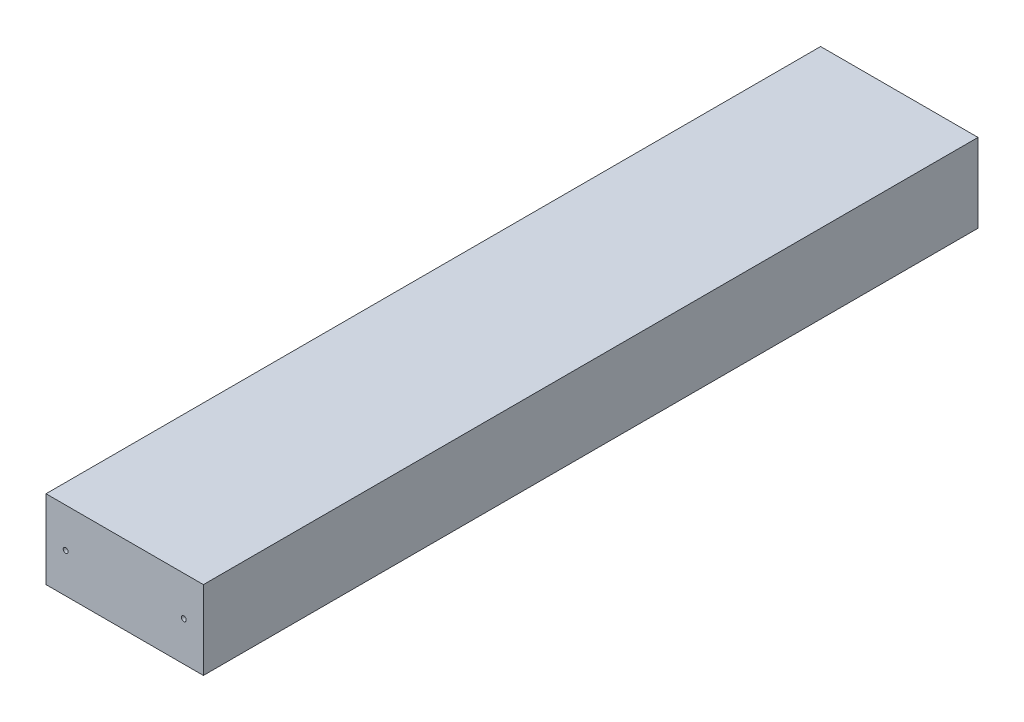
ISO-10303-21;
HEADER;
FILE_DESCRIPTION(('STEP AP214'),'2;1');
FILE_NAME('part.step','',(''),(''),'','','');
FILE_SCHEMA(('AUTOMOTIVE_DESIGN { 1 0 10303 214 1 1 1 1 }'));
ENDSEC;
DATA;
#1=APPLICATION_CONTEXT('core data for automotive mechanical design processes');
#2=APPLICATION_PROTOCOL_DEFINITION('international standard','automotive_design',2000,#1);
#3=PRODUCT_CONTEXT('',#1,'mechanical');
#4=PRODUCT('Part','Part','',(#3));
#5=PRODUCT_RELATED_PRODUCT_CATEGORY('part','',(#4));
#6=PRODUCT_DEFINITION_FORMATION('','',#4);
#7=PRODUCT_DEFINITION_CONTEXT('part definition',#1,'design');
#8=PRODUCT_DEFINITION('design','',#6,#7);
#9=PRODUCT_DEFINITION_SHAPE('','',#8);
#10=(LENGTH_UNIT() NAMED_UNIT(*) SI_UNIT(.MILLI.,.METRE.));
#11=(NAMED_UNIT(*) PLANE_ANGLE_UNIT() SI_UNIT($,.RADIAN.));
#12=(NAMED_UNIT(*) SI_UNIT($,.STERADIAN.) SOLID_ANGLE_UNIT());
#13=UNCERTAINTY_MEASURE_WITH_UNIT(LENGTH_MEASURE(1.E-05),#10,'distance_accuracy_value','');
#14=(GEOMETRIC_REPRESENTATION_CONTEXT(3) GLOBAL_UNCERTAINTY_ASSIGNED_CONTEXT((#13)) GLOBAL_UNIT_ASSIGNED_CONTEXT((#10,
#11,#12)) REPRESENTATION_CONTEXT('',''));
#15=CARTESIAN_POINT('',(0.,0.,0.));
#16=DIRECTION('',(0.,0.,1.));
#17=DIRECTION('',(1.,0.,0.));
#18=AXIS2_PLACEMENT_3D('',#15,#16,#17);
#19=CARTESIAN_POINT('',(50.8,-25.4,500.));
#20=DIRECTION('',(-1.,0.,0.));
#21=DIRECTION('',(0.,0.,1.));
#22=AXIS2_PLACEMENT_3D('',#19,#20,#21);
#23=PLANE('',#22);
#24=DIRECTION('',(0.,1.,0.));
#25=VECTOR('',#24,1.);
#26=CARTESIAN_POINT('',(50.8,-25.4,0.));
#27=LINE('',#26,#25);
#28=CARTESIAN_POINT('',(50.8,-25.4,0.));
#29=VERTEX_POINT('',#28);
#30=CARTESIAN_POINT('',(50.8,25.4,0.));
#31=VERTEX_POINT('',#30);
#32=EDGE_CURVE('E119',#29,#31,#27,.T.);
#33=ORIENTED_EDGE('',*,*,#32,.T.);
#34=DIRECTION('',(0.,0.,-1.));
#35=VECTOR('',#34,1.);
#36=CARTESIAN_POINT('',(50.8,25.4,500.));
#37=LINE('',#36,#35);
#38=CARTESIAN_POINT('',(50.8,25.4,500.));
#39=VERTEX_POINT('',#38);
#40=EDGE_CURVE('E11',#39,#31,#37,.T.);
#41=ORIENTED_EDGE('',*,*,#40,.F.);
#42=DIRECTION('',(0.,1.,0.));
#43=VECTOR('',#42,1.);
#44=CARTESIAN_POINT('',(50.8,-25.4,500.));
#45=LINE('',#44,#43);
#46=CARTESIAN_POINT('',(50.8,-25.4,500.));
#47=VERTEX_POINT('',#46);
#48=EDGE_CURVE('E102',#47,#39,#45,.T.);
#49=ORIENTED_EDGE('',*,*,#48,.F.);
#50=DIRECTION('',(0.,0.,-1.));
#51=VECTOR('',#50,1.);
#52=CARTESIAN_POINT('',(50.8,-25.4,500.));
#53=LINE('',#52,#51);
#54=EDGE_CURVE('E115',#47,#29,#53,.T.);
#55=ORIENTED_EDGE('',*,*,#54,.T.);
#56=EDGE_LOOP('',(#33,#41,#49,#55));
#57=FACE_BOUND('',#56,.T.);
#58=ADVANCED_FACE('F42',(#57),#23,.F.);
#59=CARTESIAN_POINT('',(-50.8,25.4,500.));
#60=DIRECTION('',(0.,-1.,0.));
#61=DIRECTION('',(0.,0.,-1.));
#62=AXIS2_PLACEMENT_3D('',#59,#60,#61);
#63=PLANE('',#62);
#64=DIRECTION('',(-1.,0.,0.));
#65=VECTOR('',#64,1.);
#66=CARTESIAN_POINT('',(-50.8,25.4,0.));
#67=LINE('',#66,#65);
#68=CARTESIAN_POINT('',(-50.8,25.4,0.));
#69=VERTEX_POINT('',#68);
#70=EDGE_CURVE('E107',#31,#69,#67,.T.);
#71=ORIENTED_EDGE('',*,*,#70,.T.);
#72=DIRECTION('',(0.,0.,-1.));
#73=VECTOR('',#72,1.);
#74=CARTESIAN_POINT('',(-50.8,25.4,500.));
#75=LINE('',#74,#73);
#76=CARTESIAN_POINT('',(-50.8,25.4,500.));
#77=VERTEX_POINT('',#76);
#78=EDGE_CURVE('E51',#77,#69,#75,.T.);
#79=ORIENTED_EDGE('',*,*,#78,.F.);
#80=DIRECTION('',(-1.,0.,0.));
#81=VECTOR('',#80,1.);
#82=CARTESIAN_POINT('',(-50.8,25.4,500.));
#83=LINE('',#82,#81);
#84=EDGE_CURVE('E97',#39,#77,#83,.T.);
#85=ORIENTED_EDGE('',*,*,#84,.F.);
#86=ORIENTED_EDGE('',*,*,#40,.T.);
#87=EDGE_LOOP('',(#71,#79,#85,#86));
#88=FACE_BOUND('',#87,.T.);
#89=ADVANCED_FACE('F106',(#88),#63,.F.);
#90=CARTESIAN_POINT('',(-50.8,-25.4,500.));
#91=DIRECTION('',(1.,0.,0.));
#92=DIRECTION('',(0.,0.,-1.));
#93=AXIS2_PLACEMENT_3D('',#90,#91,#92);
#94=PLANE('',#93);
#95=DIRECTION('',(0.,-1.,0.));
#96=VECTOR('',#95,1.);
#97=CARTESIAN_POINT('',(-50.8,-25.4,0.));
#98=LINE('',#97,#96);
#99=CARTESIAN_POINT('',(-50.8,-25.4,0.));
#100=VERTEX_POINT('',#99);
#101=EDGE_CURVE('E84',#69,#100,#98,.T.);
#102=ORIENTED_EDGE('',*,*,#101,.T.);
#103=DIRECTION('',(0.,0.,-1.));
#104=VECTOR('',#103,1.);
#105=CARTESIAN_POINT('',(-50.8,-25.4,500.));
#106=LINE('',#105,#104);
#107=CARTESIAN_POINT('',(-50.8,-25.4,500.));
#108=VERTEX_POINT('',#107);
#109=EDGE_CURVE('E109',#108,#100,#106,.T.);
#110=ORIENTED_EDGE('',*,*,#109,.F.);
#111=DIRECTION('',(0.,-1.,0.));
#112=VECTOR('',#111,1.);
#113=CARTESIAN_POINT('',(-50.8,-25.4,500.));
#114=LINE('',#113,#112);
#115=EDGE_CURVE('E100',#77,#108,#114,.T.);
#116=ORIENTED_EDGE('',*,*,#115,.F.);
#117=ORIENTED_EDGE('',*,*,#78,.T.);
#118=EDGE_LOOP('',(#102,#110,#116,#117));
#119=FACE_BOUND('',#118,.T.);
#120=ADVANCED_FACE('F110',(#119),#94,.F.);
#121=CARTESIAN_POINT('',(-50.8,-25.4,500.));
#122=DIRECTION('',(0.,1.,0.));
#123=DIRECTION('',(0.,0.,1.));
#124=AXIS2_PLACEMENT_3D('',#121,#122,#123);
#125=PLANE('',#124);
#126=DIRECTION('',(1.,0.,0.));
#127=VECTOR('',#126,1.);
#128=CARTESIAN_POINT('',(-50.8,-25.4,0.));
#129=LINE('',#128,#127);
#130=EDGE_CURVE('E90',#100,#29,#129,.T.);
#131=ORIENTED_EDGE('',*,*,#130,.T.);
#132=ORIENTED_EDGE('',*,*,#54,.F.);
#133=DIRECTION('',(1.,0.,0.));
#134=VECTOR('',#133,1.);
#135=CARTESIAN_POINT('',(-50.8,-25.4,500.));
#136=LINE('',#135,#134);
#137=EDGE_CURVE('E62',#108,#47,#136,.T.);
#138=ORIENTED_EDGE('',*,*,#137,.F.);
#139=ORIENTED_EDGE('',*,*,#109,.T.);
#140=EDGE_LOOP('',(#131,#132,#138,#139));
#141=FACE_BOUND('',#140,.T.);
#142=ADVANCED_FACE('F134',(#141),#125,.F.);
#143=CARTESIAN_POINT('',(0.,0.,500.));
#144=DIRECTION('',(0.,0.,-1.));
#145=DIRECTION('',(-1.,0.,0.));
#146=AXIS2_PLACEMENT_3D('',#143,#144,#145);
#147=PLANE('',#146);
#148=CARTESIAN_POINT('',(-38.1,0.,500.));
#149=DIRECTION('',(0.,0.,1.));
#150=DIRECTION('',(1.,0.,0.));
#151=AXIS2_PLACEMENT_3D('',#148,#149,#150);
#152=CIRCLE('',#151,1.58750000000001);
#153=CARTESIAN_POINT('',(-36.5125,0.,500.));
#154=VERTEX_POINT('',#153);
#155=EDGE_CURVE('E150',#154,#154,#152,.T.);
#156=ORIENTED_EDGE('',*,*,#155,.F.);
#157=EDGE_LOOP('',(#156));
#158=FACE_BOUND('',#157,.T.);
#159=CARTESIAN_POINT('',(38.1,0.,500.));
#160=DIRECTION('',(0.,0.,1.));
#161=DIRECTION('',(1.,0.,0.));
#162=AXIS2_PLACEMENT_3D('',#159,#160,#161);
#163=CIRCLE('',#162,1.58750000000001);
#164=CARTESIAN_POINT('',(39.6875,0.,500.));
#165=VERTEX_POINT('',#164);
#166=EDGE_CURVE('E142',#165,#165,#163,.T.);
#167=ORIENTED_EDGE('',*,*,#166,.F.);
#168=EDGE_LOOP('',(#167));
#169=FACE_BOUND('',#168,.T.);
#170=ORIENTED_EDGE('',*,*,#48,.T.);
#171=ORIENTED_EDGE('',*,*,#84,.T.);
#172=ORIENTED_EDGE('',*,*,#115,.T.);
#173=ORIENTED_EDGE('',*,*,#137,.T.);
#174=EDGE_LOOP('',(#170,#171,#172,#173));
#175=FACE_BOUND('',#174,.T.);
#176=ADVANCED_FACE('F98',(#158,#169,#175),#147,.F.);
#177=CARTESIAN_POINT('',(0.,0.,0.));
#178=DIRECTION('',(0.,0.,-1.));
#179=DIRECTION('',(-1.,0.,0.));
#180=AXIS2_PLACEMENT_3D('',#177,#178,#179);
#181=PLANE('',#180);
#182=CARTESIAN_POINT('',(-38.1,0.,0.));
#183=DIRECTION('',(0.,0.,1.));
#184=DIRECTION('',(1.,0.,0.));
#185=AXIS2_PLACEMENT_3D('',#182,#183,#184);
#186=CIRCLE('',#185,1.58750000000001);
#187=CARTESIAN_POINT('',(-36.5125,0.,0.));
#188=VERTEX_POINT('',#187);
#189=EDGE_CURVE('E163',#188,#188,#186,.T.);
#190=ORIENTED_EDGE('',*,*,#189,.T.);
#191=EDGE_LOOP('',(#190));
#192=FACE_BOUND('',#191,.T.);
#193=CARTESIAN_POINT('',(38.1,0.,0.));
#194=DIRECTION('',(0.,0.,1.));
#195=DIRECTION('',(1.,0.,0.));
#196=AXIS2_PLACEMENT_3D('',#193,#194,#195);
#197=CIRCLE('',#196,1.58750000000001);
#198=CARTESIAN_POINT('',(39.6875,0.,0.));
#199=VERTEX_POINT('',#198);
#200=EDGE_CURVE('E155',#199,#199,#197,.T.);
#201=ORIENTED_EDGE('',*,*,#200,.T.);
#202=EDGE_LOOP('',(#201));
#203=FACE_BOUND('',#202,.T.);
#204=ORIENTED_EDGE('',*,*,#32,.F.);
#205=ORIENTED_EDGE('',*,*,#130,.F.);
#206=ORIENTED_EDGE('',*,*,#101,.F.);
#207=ORIENTED_EDGE('',*,*,#70,.F.);
#208=EDGE_LOOP('',(#204,#205,#206,#207));
#209=FACE_BOUND('',#208,.T.);
#210=ADVANCED_FACE('F137',(#192,#203,#209),#181,.T.);
#211=CARTESIAN_POINT('',(38.1,0.,455.55));
#212=DIRECTION('',(0.,0.,1.));
#213=DIRECTION('',(1.,0.,0.));
#214=AXIS2_PLACEMENT_3D('',#211,#212,#213);
#215=CYLINDRICAL_SURFACE('',#214,1.58750000000001);
#216=CARTESIAN_POINT('',(38.1,0.,455.55));
#217=DIRECTION('',(0.,0.,1.));
#218=DIRECTION('',(1.,0.,0.));
#219=AXIS2_PLACEMENT_3D('',#216,#217,#218);
#220=CIRCLE('',#219,1.58750000000001);
#221=CARTESIAN_POINT('',(39.6875,0.,455.55));
#222=VERTEX_POINT('',#221);
#223=EDGE_CURVE('E145',#222,#222,#220,.T.);
#224=ORIENTED_EDGE('',*,*,#223,.F.);
#225=EDGE_LOOP('',(#224));
#226=FACE_BOUND('',#225,.T.);
#227=ORIENTED_EDGE('',*,*,#166,.T.);
#228=EDGE_LOOP('',(#227));
#229=FACE_BOUND('',#228,.T.);
#230=ADVANCED_FACE('F195',(#226,#229),#215,.F.);
#231=CARTESIAN_POINT('',(38.1,0.,455.55));
#232=DIRECTION('',(0.,0.,1.));
#233=DIRECTION('',(1.,0.,0.));
#234=AXIS2_PLACEMENT_3D('',#231,#232,#233);
#235=PLANE('',#234);
#236=ORIENTED_EDGE('',*,*,#223,.T.);
#237=EDGE_LOOP('',(#236));
#238=FACE_BOUND('',#237,.T.);
#239=ADVANCED_FACE('F202',(#238),#235,.T.);
#240=CARTESIAN_POINT('',(-38.1,0.,455.55));
#241=DIRECTION('',(0.,0.,1.));
#242=DIRECTION('',(1.,0.,0.));
#243=AXIS2_PLACEMENT_3D('',#240,#241,#242);
#244=CYLINDRICAL_SURFACE('',#243,1.58750000000001);
#245=CARTESIAN_POINT('',(-38.1,0.,455.55));
#246=DIRECTION('',(0.,0.,1.));
#247=DIRECTION('',(1.,0.,0.));
#248=AXIS2_PLACEMENT_3D('',#245,#246,#247);
#249=CIRCLE('',#248,1.58750000000001);
#250=CARTESIAN_POINT('',(-36.5125,0.,455.55));
#251=VERTEX_POINT('',#250);
#252=EDGE_CURVE('E123',#251,#251,#249,.T.);
#253=ORIENTED_EDGE('',*,*,#252,.F.);
#254=EDGE_LOOP('',(#253));
#255=FACE_BOUND('',#254,.T.);
#256=ORIENTED_EDGE('',*,*,#155,.T.);
#257=EDGE_LOOP('',(#256));
#258=FACE_BOUND('',#257,.T.);
#259=ADVANCED_FACE('F206',(#255,#258),#244,.F.);
#260=CARTESIAN_POINT('',(-38.1,0.,455.55));
#261=DIRECTION('',(0.,0.,1.));
#262=DIRECTION('',(1.,0.,0.));
#263=AXIS2_PLACEMENT_3D('',#260,#261,#262);
#264=PLANE('',#263);
#265=ORIENTED_EDGE('',*,*,#252,.T.);
#266=EDGE_LOOP('',(#265));
#267=FACE_BOUND('',#266,.T.);
#268=ADVANCED_FACE('F210',(#267),#264,.T.);
#269=CARTESIAN_POINT('',(38.1,0.,44.45));
#270=DIRECTION('',(0.,0.,-1.));
#271=DIRECTION('',(-1.,0.,0.));
#272=AXIS2_PLACEMENT_3D('',#269,#270,#271);
#273=CYLINDRICAL_SURFACE('',#272,1.58750000000001);
#274=CARTESIAN_POINT('',(38.1,0.,44.45));
#275=DIRECTION('',(0.,0.,1.));
#276=DIRECTION('',(1.,0.,0.));
#277=AXIS2_PLACEMENT_3D('',#274,#275,#276);
#278=CIRCLE('',#277,1.58750000000001);
#279=CARTESIAN_POINT('',(39.6875,0.,44.45));
#280=VERTEX_POINT('',#279);
#281=EDGE_CURVE('E159',#280,#280,#278,.T.);
#282=ORIENTED_EDGE('',*,*,#281,.T.);
#283=EDGE_LOOP('',(#282));
#284=FACE_BOUND('',#283,.T.);
#285=ORIENTED_EDGE('',*,*,#200,.F.);
#286=EDGE_LOOP('',(#285));
#287=FACE_BOUND('',#286,.T.);
#288=ADVANCED_FACE('F214',(#284,#287),#273,.F.);
#289=CARTESIAN_POINT('',(38.1,0.,44.45));
#290=DIRECTION('',(0.,0.,-1.));
#291=DIRECTION('',(1.,0.,0.));
#292=AXIS2_PLACEMENT_3D('',#289,#290,#291);
#293=PLANE('',#292);
#294=ORIENTED_EDGE('',*,*,#281,.F.);
#295=EDGE_LOOP('',(#294));
#296=FACE_BOUND('',#295,.T.);
#297=ADVANCED_FACE('F180',(#296),#293,.T.);
#298=CARTESIAN_POINT('',(-38.1,0.,44.45));
#299=DIRECTION('',(0.,0.,-1.));
#300=DIRECTION('',(-1.,0.,0.));
#301=AXIS2_PLACEMENT_3D('',#298,#299,#300);
#302=CYLINDRICAL_SURFACE('',#301,1.58750000000001);
#303=CARTESIAN_POINT('',(-38.1,0.,44.45));
#304=DIRECTION('',(0.,0.,1.));
#305=DIRECTION('',(1.,0.,0.));
#306=AXIS2_PLACEMENT_3D('',#303,#304,#305);
#307=CIRCLE('',#306,1.58750000000001);
#308=CARTESIAN_POINT('',(-36.5125,0.,44.45));
#309=VERTEX_POINT('',#308);
#310=EDGE_CURVE('E146',#309,#309,#307,.T.);
#311=ORIENTED_EDGE('',*,*,#310,.T.);
#312=EDGE_LOOP('',(#311));
#313=FACE_BOUND('',#312,.T.);
#314=ORIENTED_EDGE('',*,*,#189,.F.);
#315=EDGE_LOOP('',(#314));
#316=FACE_BOUND('',#315,.T.);
#317=ADVANCED_FACE('F171',(#313,#316),#302,.F.);
#318=CARTESIAN_POINT('',(-38.1,0.,44.45));
#319=DIRECTION('',(0.,0.,-1.));
#320=DIRECTION('',(1.,0.,0.));
#321=AXIS2_PLACEMENT_3D('',#318,#319,#320);
#322=PLANE('',#321);
#323=ORIENTED_EDGE('',*,*,#310,.F.);
#324=EDGE_LOOP('',(#323));
#325=FACE_BOUND('',#324,.T.);
#326=ADVANCED_FACE('F174',(#325),#322,.T.);
#327=CLOSED_SHELL('',(#58,#89,#120,#142,#176,#210,#230,#239,#259,#268,#288,#297,#317,#326));
#328=MANIFOLD_SOLID_BREP('B2',#327);
#329=ADVANCED_BREP_SHAPE_REPRESENTATION('',(#18,#328),#14);
#330=SHAPE_DEFINITION_REPRESENTATION(#9,#329);
ENDSEC;
END-ISO-10303-21;
